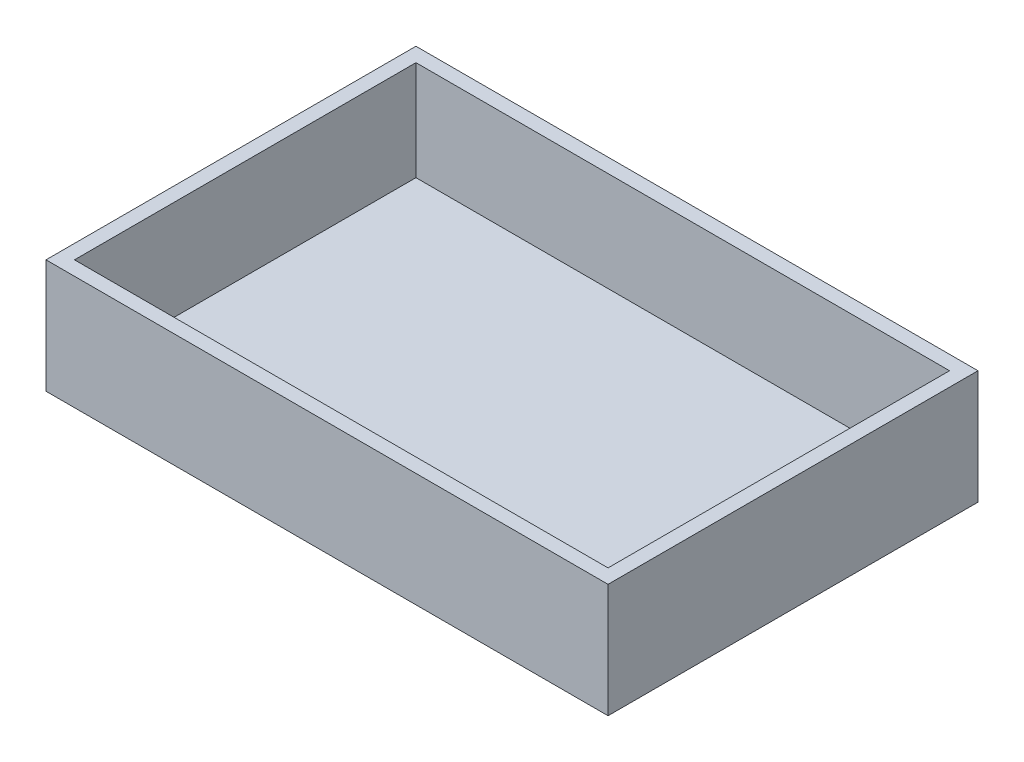
ISO-10303-21;
HEADER;
FILE_DESCRIPTION(('STEP AP214'),'2;1');
FILE_NAME('part.step','',(''),(''),'','','');
FILE_SCHEMA(('AUTOMOTIVE_DESIGN { 1 0 10303 214 1 1 1 1 }'));
ENDSEC;
DATA;
#1=APPLICATION_CONTEXT('core data for automotive mechanical design processes');
#2=APPLICATION_PROTOCOL_DEFINITION('international standard','automotive_design',2000,#1);
#3=PRODUCT_CONTEXT('',#1,'mechanical');
#4=PRODUCT('Part','Part','',(#3));
#5=PRODUCT_RELATED_PRODUCT_CATEGORY('part','',(#4));
#6=PRODUCT_DEFINITION_FORMATION('','',#4);
#7=PRODUCT_DEFINITION_CONTEXT('part definition',#1,'design');
#8=PRODUCT_DEFINITION('design','',#6,#7);
#9=PRODUCT_DEFINITION_SHAPE('','',#8);
#10=(LENGTH_UNIT() NAMED_UNIT(*) SI_UNIT(.MILLI.,.METRE.));
#11=(NAMED_UNIT(*) PLANE_ANGLE_UNIT() SI_UNIT($,.RADIAN.));
#12=(NAMED_UNIT(*) SI_UNIT($,.STERADIAN.) SOLID_ANGLE_UNIT());
#13=UNCERTAINTY_MEASURE_WITH_UNIT(LENGTH_MEASURE(1.E-05),#10,'distance_accuracy_value','');
#14=(GEOMETRIC_REPRESENTATION_CONTEXT(3) GLOBAL_UNCERTAINTY_ASSIGNED_CONTEXT((#13)) GLOBAL_UNIT_ASSIGNED_CONTEXT((#10,
#11,#12)) REPRESENTATION_CONTEXT('',''));
#15=CARTESIAN_POINT('',(0.,0.,0.));
#16=DIRECTION('',(0.,0.,1.));
#17=DIRECTION('',(1.,0.,0.));
#18=AXIS2_PLACEMENT_3D('',#15,#16,#17);
#19=CARTESIAN_POINT('',(0.,70.,0.));
#20=DIRECTION('',(0.,1.,0.));
#21=DIRECTION('',(0.,0.,1.));
#22=AXIS2_PLACEMENT_3D('',#19,#20,#21);
#23=PLANE('',#22);
#24=DIRECTION('',(0.,0.,1.));
#25=VECTOR('',#24,1.);
#26=CARTESIAN_POINT('',(-197.5,70.,-130.));
#27=LINE('',#26,#25);
#28=CARTESIAN_POINT('',(-197.5,70.,-130.));
#29=VERTEX_POINT('',#28);
#30=CARTESIAN_POINT('',(-197.5,70.,130.));
#31=VERTEX_POINT('',#30);
#32=EDGE_CURVE('E150',#29,#31,#27,.T.);
#33=ORIENTED_EDGE('',*,*,#32,.T.);
#34=DIRECTION('',(1.,0.,0.));
#35=VECTOR('',#34,1.);
#36=CARTESIAN_POINT('',(-197.5,70.,130.));
#37=LINE('',#36,#35);
#38=CARTESIAN_POINT('',(197.5,70.,130.));
#39=VERTEX_POINT('',#38);
#40=EDGE_CURVE('E103',#31,#39,#37,.T.);
#41=ORIENTED_EDGE('',*,*,#40,.T.);
#42=DIRECTION('',(0.,0.,-1.));
#43=VECTOR('',#42,1.);
#44=CARTESIAN_POINT('',(197.5,70.,-130.));
#45=LINE('',#44,#43);
#46=CARTESIAN_POINT('',(197.5,70.,-130.));
#47=VERTEX_POINT('',#46);
#48=EDGE_CURVE('E153',#39,#47,#45,.T.);
#49=ORIENTED_EDGE('',*,*,#48,.T.);
#50=DIRECTION('',(-1.,0.,0.));
#51=VECTOR('',#50,1.);
#52=CARTESIAN_POINT('',(-197.5,70.,-130.));
#53=LINE('',#52,#51);
#54=EDGE_CURVE('E56',#47,#29,#53,.T.);
#55=ORIENTED_EDGE('',*,*,#54,.T.);
#56=EDGE_LOOP('',(#33,#41,#49,#55));
#57=FACE_BOUND('',#56,.T.);
#58=DIRECTION('',(-1.,0.,0.));
#59=VECTOR('',#58,1.);
#60=CARTESIAN_POINT('',(-187.5,70.,-120.));
#61=LINE('',#60,#59);
#62=CARTESIAN_POINT('',(187.5,70.,-120.));
#63=VERTEX_POINT('',#62);
#64=CARTESIAN_POINT('',(-187.5,70.,-120.));
#65=VERTEX_POINT('',#64);
#66=EDGE_CURVE('E125',#63,#65,#61,.T.);
#67=ORIENTED_EDGE('',*,*,#66,.F.);
#68=DIRECTION('',(0.,0.,-1.));
#69=VECTOR('',#68,1.);
#70=CARTESIAN_POINT('',(187.5,70.,-120.));
#71=LINE('',#70,#69);
#72=CARTESIAN_POINT('',(187.5,70.,120.));
#73=VERTEX_POINT('',#72);
#74=EDGE_CURVE('E123',#73,#63,#71,.T.);
#75=ORIENTED_EDGE('',*,*,#74,.F.);
#76=DIRECTION('',(1.,0.,0.));
#77=VECTOR('',#76,1.);
#78=CARTESIAN_POINT('',(-187.5,70.,120.));
#79=LINE('',#78,#77);
#80=CARTESIAN_POINT('',(-187.5,70.,120.));
#81=VERTEX_POINT('',#80);
#82=EDGE_CURVE('E130',#81,#73,#79,.T.);
#83=ORIENTED_EDGE('',*,*,#82,.F.);
#84=DIRECTION('',(0.,0.,1.));
#85=VECTOR('',#84,1.);
#86=CARTESIAN_POINT('',(-187.5,70.,-120.));
#87=LINE('',#86,#85);
#88=EDGE_CURVE('E128',#65,#81,#87,.T.);
#89=ORIENTED_EDGE('',*,*,#88,.F.);
#90=EDGE_LOOP('',(#67,#75,#83,#89));
#91=FACE_BOUND('',#90,.T.);
#92=ADVANCED_FACE('F33',(#57,#91),#23,.T.);
#93=CARTESIAN_POINT('',(-197.5,70.,-130.));
#94=DIRECTION('',(1.,0.,0.));
#95=DIRECTION('',(0.,0.,-1.));
#96=AXIS2_PLACEMENT_3D('',#93,#94,#95);
#97=PLANE('',#96);
#98=DIRECTION('',(0.,-1.,0.));
#99=VECTOR('',#98,1.);
#100=CARTESIAN_POINT('',(-197.5,70.,-130.));
#101=LINE('',#100,#99);
#102=CARTESIAN_POINT('',(-197.5,-10.,-130.));
#103=VERTEX_POINT('',#102);
#104=EDGE_CURVE('E108',#29,#103,#101,.T.);
#105=ORIENTED_EDGE('',*,*,#104,.T.);
#106=DIRECTION('',(0.,0.,-1.));
#107=VECTOR('',#106,1.);
#108=CARTESIAN_POINT('',(-197.5,-10.,130.));
#109=LINE('',#108,#107);
#110=CARTESIAN_POINT('',(-197.5,-10.,130.));
#111=VERTEX_POINT('',#110);
#112=EDGE_CURVE('E107',#111,#103,#109,.T.);
#113=ORIENTED_EDGE('',*,*,#112,.F.);
#114=DIRECTION('',(0.,-1.,0.));
#115=VECTOR('',#114,1.);
#116=CARTESIAN_POINT('',(-197.5,70.,130.));
#117=LINE('',#116,#115);
#118=EDGE_CURVE('E11',#31,#111,#117,.T.);
#119=ORIENTED_EDGE('',*,*,#118,.F.);
#120=ORIENTED_EDGE('',*,*,#32,.F.);
#121=EDGE_LOOP('',(#105,#113,#119,#120));
#122=FACE_BOUND('',#121,.T.);
#123=ADVANCED_FACE('F35',(#122),#97,.F.);
#124=CARTESIAN_POINT('',(-197.5,70.,130.));
#125=DIRECTION('',(0.,0.,-1.));
#126=DIRECTION('',(-1.,0.,0.));
#127=AXIS2_PLACEMENT_3D('',#124,#125,#126);
#128=PLANE('',#127);
#129=ORIENTED_EDGE('',*,*,#118,.T.);
#130=DIRECTION('',(-1.,0.,0.));
#131=VECTOR('',#130,1.);
#132=CARTESIAN_POINT('',(197.5,-10.,130.));
#133=LINE('',#132,#131);
#134=CARTESIAN_POINT('',(197.5,-10.,130.));
#135=VERTEX_POINT('',#134);
#136=EDGE_CURVE('E102',#135,#111,#133,.T.);
#137=ORIENTED_EDGE('',*,*,#136,.F.);
#138=DIRECTION('',(0.,-1.,0.));
#139=VECTOR('',#138,1.);
#140=CARTESIAN_POINT('',(197.5,70.,130.));
#141=LINE('',#140,#139);
#142=EDGE_CURVE('E41',#39,#135,#141,.T.);
#143=ORIENTED_EDGE('',*,*,#142,.F.);
#144=ORIENTED_EDGE('',*,*,#40,.F.);
#145=EDGE_LOOP('',(#129,#137,#143,#144));
#146=FACE_BOUND('',#145,.T.);
#147=ADVANCED_FACE('F99',(#146),#128,.F.);
#148=CARTESIAN_POINT('',(197.5,70.,-130.));
#149=DIRECTION('',(-1.,0.,0.));
#150=DIRECTION('',(0.,0.,1.));
#151=AXIS2_PLACEMENT_3D('',#148,#149,#150);
#152=PLANE('',#151);
#153=ORIENTED_EDGE('',*,*,#142,.T.);
#154=DIRECTION('',(0.,0.,1.));
#155=VECTOR('',#154,1.);
#156=CARTESIAN_POINT('',(197.5,-10.,-130.));
#157=LINE('',#156,#155);
#158=CARTESIAN_POINT('',(197.5,-10.,-130.));
#159=VERTEX_POINT('',#158);
#160=EDGE_CURVE('E117',#159,#135,#157,.T.);
#161=ORIENTED_EDGE('',*,*,#160,.F.);
#162=DIRECTION('',(0.,-1.,0.));
#163=VECTOR('',#162,1.);
#164=CARTESIAN_POINT('',(197.5,70.,-130.));
#165=LINE('',#164,#163);
#166=EDGE_CURVE('E157',#47,#159,#165,.T.);
#167=ORIENTED_EDGE('',*,*,#166,.F.);
#168=ORIENTED_EDGE('',*,*,#48,.F.);
#169=EDGE_LOOP('',(#153,#161,#167,#168));
#170=FACE_BOUND('',#169,.T.);
#171=ADVANCED_FACE('F160',(#170),#152,.F.);
#172=CARTESIAN_POINT('',(-197.5,70.,-130.));
#173=DIRECTION('',(0.,0.,1.));
#174=DIRECTION('',(1.,0.,0.));
#175=AXIS2_PLACEMENT_3D('',#172,#173,#174);
#176=PLANE('',#175);
#177=ORIENTED_EDGE('',*,*,#166,.T.);
#178=DIRECTION('',(1.,0.,0.));
#179=VECTOR('',#178,1.);
#180=CARTESIAN_POINT('',(-197.5,-10.,-130.));
#181=LINE('',#180,#179);
#182=EDGE_CURVE('E112',#103,#159,#181,.T.);
#183=ORIENTED_EDGE('',*,*,#182,.F.);
#184=ORIENTED_EDGE('',*,*,#104,.F.);
#185=ORIENTED_EDGE('',*,*,#54,.F.);
#186=EDGE_LOOP('',(#177,#183,#184,#185));
#187=FACE_BOUND('',#186,.T.);
#188=ADVANCED_FACE('F196',(#187),#176,.F.);
#189=CARTESIAN_POINT('',(187.5,70.,-120.));
#190=DIRECTION('',(-1.,0.,0.));
#191=DIRECTION('',(0.,0.,1.));
#192=AXIS2_PLACEMENT_3D('',#189,#190,#191);
#193=PLANE('',#192);
#194=DIRECTION('',(0.,0.,-1.));
#195=VECTOR('',#194,1.);
#196=CARTESIAN_POINT('',(187.5,0.,-120.));
#197=LINE('',#196,#195);
#198=CARTESIAN_POINT('',(187.5,0.,120.));
#199=VERTEX_POINT('',#198);
#200=CARTESIAN_POINT('',(187.5,0.,-120.));
#201=VERTEX_POINT('',#200);
#202=EDGE_CURVE('E122',#199,#201,#197,.T.);
#203=ORIENTED_EDGE('',*,*,#202,.F.);
#204=DIRECTION('',(0.,-1.,0.));
#205=VECTOR('',#204,1.);
#206=CARTESIAN_POINT('',(187.5,70.,120.));
#207=LINE('',#206,#205);
#208=EDGE_CURVE('E132',#73,#199,#207,.T.);
#209=ORIENTED_EDGE('',*,*,#208,.F.);
#210=ORIENTED_EDGE('',*,*,#74,.T.);
#211=DIRECTION('',(0.,-1.,0.));
#212=VECTOR('',#211,1.);
#213=CARTESIAN_POINT('',(187.5,70.,-120.));
#214=LINE('',#213,#212);
#215=EDGE_CURVE('E147',#63,#201,#214,.T.);
#216=ORIENTED_EDGE('',*,*,#215,.T.);
#217=EDGE_LOOP('',(#203,#209,#210,#216));
#218=FACE_BOUND('',#217,.T.);
#219=ADVANCED_FACE('F180',(#218),#193,.T.);
#220=CARTESIAN_POINT('',(-187.5,70.,-120.));
#221=DIRECTION('',(0.,0.,1.));
#222=DIRECTION('',(1.,0.,0.));
#223=AXIS2_PLACEMENT_3D('',#220,#221,#222);
#224=PLANE('',#223);
#225=DIRECTION('',(-1.,0.,0.));
#226=VECTOR('',#225,1.);
#227=CARTESIAN_POINT('',(-187.5,0.,-120.));
#228=LINE('',#227,#226);
#229=CARTESIAN_POINT('',(-187.5,0.,-120.));
#230=VERTEX_POINT('',#229);
#231=EDGE_CURVE('E135',#201,#230,#228,.T.);
#232=ORIENTED_EDGE('',*,*,#231,.F.);
#233=ORIENTED_EDGE('',*,*,#215,.F.);
#234=ORIENTED_EDGE('',*,*,#66,.T.);
#235=DIRECTION('',(0.,-1.,0.));
#236=VECTOR('',#235,1.);
#237=CARTESIAN_POINT('',(-187.5,70.,-120.));
#238=LINE('',#237,#236);
#239=EDGE_CURVE('E145',#65,#230,#238,.T.);
#240=ORIENTED_EDGE('',*,*,#239,.T.);
#241=EDGE_LOOP('',(#232,#233,#234,#240));
#242=FACE_BOUND('',#241,.T.);
#243=ADVANCED_FACE('F172',(#242),#224,.T.);
#244=CARTESIAN_POINT('',(-187.5,70.,-120.));
#245=DIRECTION('',(1.,0.,0.));
#246=DIRECTION('',(0.,0.,-1.));
#247=AXIS2_PLACEMENT_3D('',#244,#245,#246);
#248=PLANE('',#247);
#249=DIRECTION('',(0.,0.,1.));
#250=VECTOR('',#249,1.);
#251=CARTESIAN_POINT('',(-187.5,0.,-120.));
#252=LINE('',#251,#250);
#253=CARTESIAN_POINT('',(-187.5,0.,120.));
#254=VERTEX_POINT('',#253);
#255=EDGE_CURVE('E138',#230,#254,#252,.T.);
#256=ORIENTED_EDGE('',*,*,#255,.F.);
#257=ORIENTED_EDGE('',*,*,#239,.F.);
#258=ORIENTED_EDGE('',*,*,#88,.T.);
#259=DIRECTION('',(0.,-1.,0.));
#260=VECTOR('',#259,1.);
#261=CARTESIAN_POINT('',(-187.5,70.,120.));
#262=LINE('',#261,#260);
#263=EDGE_CURVE('E48',#81,#254,#262,.T.);
#264=ORIENTED_EDGE('',*,*,#263,.T.);
#265=EDGE_LOOP('',(#256,#257,#258,#264));
#266=FACE_BOUND('',#265,.T.);
#267=ADVANCED_FACE('F175',(#266),#248,.T.);
#268=CARTESIAN_POINT('',(-187.5,70.,120.));
#269=DIRECTION('',(0.,0.,-1.));
#270=DIRECTION('',(-1.,0.,0.));
#271=AXIS2_PLACEMENT_3D('',#268,#269,#270);
#272=PLANE('',#271);
#273=DIRECTION('',(1.,0.,0.));
#274=VECTOR('',#273,1.);
#275=CARTESIAN_POINT('',(-187.5,0.,120.));
#276=LINE('',#275,#274);
#277=EDGE_CURVE('E126',#254,#199,#276,.T.);
#278=ORIENTED_EDGE('',*,*,#277,.F.);
#279=ORIENTED_EDGE('',*,*,#263,.F.);
#280=ORIENTED_EDGE('',*,*,#82,.T.);
#281=ORIENTED_EDGE('',*,*,#208,.T.);
#282=EDGE_LOOP('',(#278,#279,#280,#281));
#283=FACE_BOUND('',#282,.T.);
#284=ADVANCED_FACE('F182',(#283),#272,.T.);
#285=CARTESIAN_POINT('',(0.,0.,0.));
#286=DIRECTION('',(0.,-1.,0.));
#287=DIRECTION('',(0.,0.,-1.));
#288=AXIS2_PLACEMENT_3D('',#285,#286,#287);
#289=PLANE('',#288);
#290=ORIENTED_EDGE('',*,*,#202,.T.);
#291=ORIENTED_EDGE('',*,*,#231,.T.);
#292=ORIENTED_EDGE('',*,*,#255,.T.);
#293=ORIENTED_EDGE('',*,*,#277,.T.);
#294=EDGE_LOOP('',(#290,#291,#292,#293));
#295=FACE_BOUND('',#294,.T.);
#296=ADVANCED_FACE('F177',(#295),#289,.F.);
#297=CARTESIAN_POINT('',(0.,-10.,0.));
#298=DIRECTION('',(0.,-1.,0.));
#299=DIRECTION('',(0.,0.,-1.));
#300=AXIS2_PLACEMENT_3D('',#297,#298,#299);
#301=PLANE('',#300);
#302=ORIENTED_EDGE('',*,*,#136,.T.);
#303=ORIENTED_EDGE('',*,*,#112,.T.);
#304=ORIENTED_EDGE('',*,*,#182,.T.);
#305=ORIENTED_EDGE('',*,*,#160,.T.);
#306=EDGE_LOOP('',(#302,#303,#304,#305));
#307=FACE_BOUND('',#306,.T.);
#308=ADVANCED_FACE('F115',(#307),#301,.T.);
#309=CLOSED_SHELL('',(#92,#123,#147,#171,#188,#219,#243,#267,#284,#296,#308));
#310=MANIFOLD_SOLID_BREP('B2',#309);
#311=ADVANCED_BREP_SHAPE_REPRESENTATION('',(#18,#310),#14);
#312=SHAPE_DEFINITION_REPRESENTATION(#9,#311);
ENDSEC;
END-ISO-10303-21;
